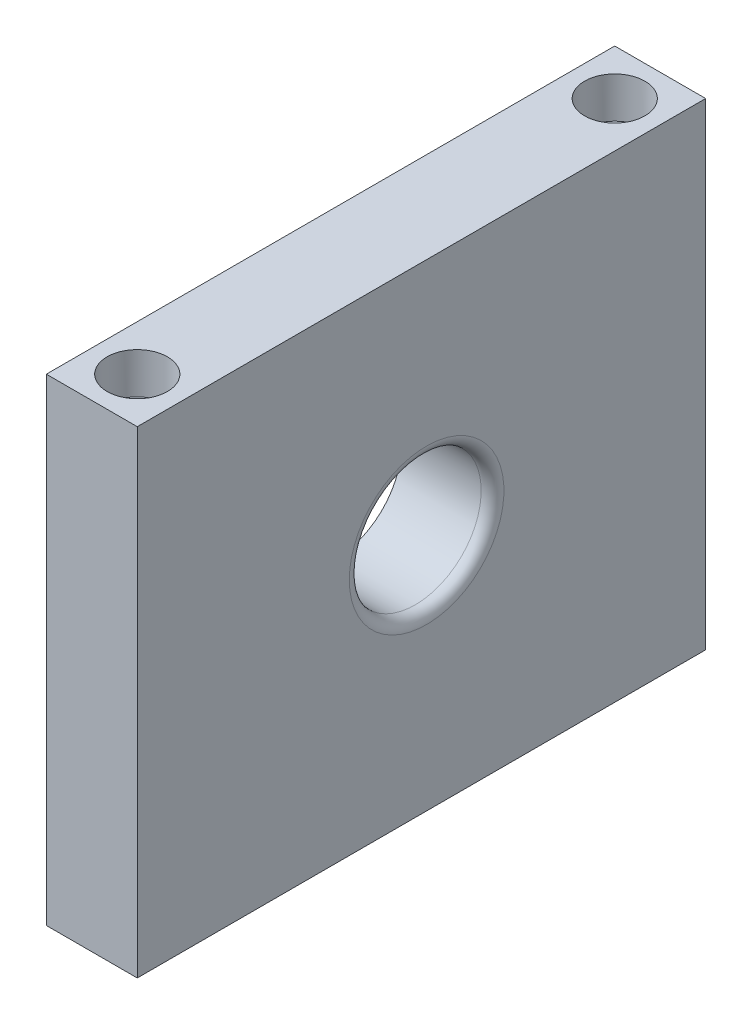
ISO-10303-21;
HEADER;
FILE_DESCRIPTION(('STEP AP214'),'2;1');
FILE_NAME('part.step','',(''),(''),'','','');
FILE_SCHEMA(('AUTOMOTIVE_DESIGN { 1 0 10303 214 1 1 1 1 }'));
ENDSEC;
DATA;
#1=APPLICATION_CONTEXT('core data for automotive mechanical design processes');
#2=APPLICATION_PROTOCOL_DEFINITION('international standard','automotive_design',2000,#1);
#3=PRODUCT_CONTEXT('',#1,'mechanical');
#4=PRODUCT('Part','Part','',(#3));
#5=PRODUCT_RELATED_PRODUCT_CATEGORY('part','',(#4));
#6=PRODUCT_DEFINITION_FORMATION('','',#4);
#7=PRODUCT_DEFINITION_CONTEXT('part definition',#1,'design');
#8=PRODUCT_DEFINITION('design','',#6,#7);
#9=PRODUCT_DEFINITION_SHAPE('','',#8);
#10=(LENGTH_UNIT() NAMED_UNIT(*) SI_UNIT(.MILLI.,.METRE.));
#11=(NAMED_UNIT(*) PLANE_ANGLE_UNIT() SI_UNIT($,.RADIAN.));
#12=(NAMED_UNIT(*) SI_UNIT($,.STERADIAN.) SOLID_ANGLE_UNIT());
#13=UNCERTAINTY_MEASURE_WITH_UNIT(LENGTH_MEASURE(1.E-05),#10,'distance_accuracy_value','');
#14=(GEOMETRIC_REPRESENTATION_CONTEXT(3) GLOBAL_UNCERTAINTY_ASSIGNED_CONTEXT((#13)) GLOBAL_UNIT_ASSIGNED_CONTEXT((#10,
#11,#12)) REPRESENTATION_CONTEXT('',''));
#15=CARTESIAN_POINT('',(0.,0.,0.));
#16=DIRECTION('',(0.,0.,1.));
#17=DIRECTION('',(1.,0.,0.));
#18=AXIS2_PLACEMENT_3D('',#15,#16,#17);
#19=CARTESIAN_POINT('',(-14.2230483271375,-3.6,-32.3847583643123));
#20=DIRECTION('',(0.,1.,0.));
#21=DIRECTION('',(0.,0.,1.));
#22=AXIS2_PLACEMENT_3D('',#19,#20,#21);
#23=PLANE('',#22);
#24=CARTESIAN_POINT('',(-14.2230483271375,-3.6,-32.3847583643123));
#25=DIRECTION('',(0.,1.,0.));
#26=DIRECTION('',(0.,0.,1.));
#27=AXIS2_PLACEMENT_3D('',#24,#25,#26);
#28=CIRCLE('',#27,1.4);
#29=CARTESIAN_POINT('',(-14.2230483271375,-3.6,-30.9847583643123));
#30=VERTEX_POINT('',#29);
#31=EDGE_CURVE('E118',#30,#30,#28,.T.);
#32=ORIENTED_EDGE('',*,*,#31,.F.);
#33=EDGE_LOOP('',(#32));
#34=FACE_BOUND('',#33,.T.);
#35=CARTESIAN_POINT('',(-14.2230483271375,-3.6,-32.3847583643123));
#36=DIRECTION('',(0.,1.,0.));
#37=DIRECTION('',(0.,0.,1.));
#38=AXIS2_PLACEMENT_3D('',#35,#36,#37);
#39=CIRCLE('',#38,2.65);
#40=CARTESIAN_POINT('',(-14.2230483271375,-3.6,-29.7347583643123));
#41=VERTEX_POINT('',#40);
#42=EDGE_CURVE('E160',#41,#41,#39,.T.);
#43=ORIENTED_EDGE('',*,*,#42,.T.);
#44=EDGE_LOOP('',(#43));
#45=FACE_BOUND('',#44,.T.);
#46=ADVANCED_FACE('F40',(#34,#45),#23,.T.);
#47=CARTESIAN_POINT('',(-14.2230483271375,-3.6,-32.3847583643123));
#48=DIRECTION('',(0.,1.,0.));
#49=DIRECTION('',(0.,0.,1.));
#50=AXIS2_PLACEMENT_3D('',#47,#48,#49);
#51=CYLINDRICAL_SURFACE('',#50,2.65);
#52=CARTESIAN_POINT('',(-14.2230483271375,0.,-32.3847583643123));
#53=DIRECTION('',(0.,-1.,0.));
#54=DIRECTION('',(0.,0.,-1.));
#55=AXIS2_PLACEMENT_3D('',#52,#53,#54);
#56=CIRCLE('',#55,2.65);
#57=CARTESIAN_POINT('',(-14.2230483271375,0.,-35.0347583643123));
#58=VERTEX_POINT('',#57);
#59=EDGE_CURVE('E132',#58,#58,#56,.F.);
#60=ORIENTED_EDGE('',*,*,#59,.T.);
#61=EDGE_LOOP('',(#60));
#62=FACE_BOUND('',#61,.T.);
#63=ORIENTED_EDGE('',*,*,#42,.F.);
#64=EDGE_LOOP('',(#63));
#65=FACE_BOUND('',#64,.T.);
#66=ADVANCED_FACE('F209',(#62,#65),#51,.F.);
#67=CARTESIAN_POINT('',(14.7769516728625,0.,-36.3847583643123));
#68=DIRECTION('',(0.,-1.,0.));
#69=DIRECTION('',(0.,0.,-1.));
#70=AXIS2_PLACEMENT_3D('',#67,#68,#69);
#71=PLANE('',#70);
#72=DIRECTION('',(0.,0.,1.));
#73=VECTOR('',#72,1.);
#74=CARTESIAN_POINT('',(-18.2230483271375,0.,0.));
#75=LINE('',#74,#73);
#76=CARTESIAN_POINT('',(-18.2230483271376,0.,-36.3847583643123));
#77=VERTEX_POINT('',#76);
#78=CARTESIAN_POINT('',(-18.2230483271375,0.,13.6152416356877));
#79=VERTEX_POINT('',#78);
#80=EDGE_CURVE('E81',#77,#79,#75,.T.);
#81=ORIENTED_EDGE('',*,*,#80,.T.);
#82=DIRECTION('',(1.,0.,0.));
#83=VECTOR('',#82,1.);
#84=CARTESIAN_POINT('',(14.7769516728625,0.,13.6152416356877));
#85=LINE('',#84,#83);
#86=CARTESIAN_POINT('',(-10.2230483271376,0.,13.6152416356877));
#87=VERTEX_POINT('',#86);
#88=EDGE_CURVE('E84',#79,#87,#85,.T.);
#89=ORIENTED_EDGE('',*,*,#88,.T.);
#90=DIRECTION('',(0.,0.,1.));
#91=VECTOR('',#90,1.);
#92=CARTESIAN_POINT('',(-10.2230483271376,0.,-36.3847583643123));
#93=LINE('',#92,#91);
#94=CARTESIAN_POINT('',(-10.2230483271376,0.,-36.3847583643123));
#95=VERTEX_POINT('',#94);
#96=EDGE_CURVE('E164',#95,#87,#93,.T.);
#97=ORIENTED_EDGE('',*,*,#96,.F.);
#98=DIRECTION('',(1.,0.,0.));
#99=VECTOR('',#98,1.);
#100=CARTESIAN_POINT('',(14.7769516728625,0.,-36.3847583643123));
#101=LINE('',#100,#99);
#102=EDGE_CURVE('E87',#77,#95,#101,.T.);
#103=ORIENTED_EDGE('',*,*,#102,.F.);
#104=EDGE_LOOP('',(#81,#89,#97,#103));
#105=FACE_BOUND('',#104,.T.);
#106=CARTESIAN_POINT('',(-14.2230483271375,0.,9.61524163568773));
#107=DIRECTION('',(0.,-1.,0.));
#108=DIRECTION('',(0.,0.,-1.));
#109=AXIS2_PLACEMENT_3D('',#106,#107,#108);
#110=CIRCLE('',#109,2.65);
#111=CARTESIAN_POINT('',(-14.2230483271375,0.,6.96524163568774));
#112=VERTEX_POINT('',#111);
#113=EDGE_CURVE('E92',#112,#112,#110,.F.);
#114=ORIENTED_EDGE('',*,*,#113,.F.);
#115=EDGE_LOOP('',(#114));
#116=FACE_BOUND('',#115,.T.);
#117=ORIENTED_EDGE('',*,*,#59,.F.);
#118=EDGE_LOOP('',(#117));
#119=FACE_BOUND('',#118,.T.);
#120=ADVANCED_FACE('F82',(#105,#116,#119),#71,.F.);
#121=CARTESIAN_POINT('',(-14.2230483271375,-3.6,9.61524163568773));
#122=DIRECTION('',(0.,1.,0.));
#123=DIRECTION('',(0.,0.,1.));
#124=AXIS2_PLACEMENT_3D('',#121,#122,#123);
#125=PLANE('',#124);
#126=CARTESIAN_POINT('',(-14.2230483271375,-3.6,9.61524163568774));
#127=DIRECTION('',(0.,-1.,0.));
#128=DIRECTION('',(0.,0.,-1.));
#129=AXIS2_PLACEMENT_3D('',#126,#127,#128);
#130=CIRCLE('',#129,1.4);
#131=CARTESIAN_POINT('',(-14.2230483271375,-3.6,8.21524163568774));
#132=VERTEX_POINT('',#131);
#133=EDGE_CURVE('E128',#132,#132,#130,.T.);
#134=ORIENTED_EDGE('',*,*,#133,.T.);
#135=EDGE_LOOP('',(#134));
#136=FACE_BOUND('',#135,.T.);
#137=CARTESIAN_POINT('',(-14.2230483271375,-3.6,9.61524163568773));
#138=DIRECTION('',(0.,1.,0.));
#139=DIRECTION('',(0.,0.,1.));
#140=AXIS2_PLACEMENT_3D('',#137,#138,#139);
#141=CIRCLE('',#140,2.65);
#142=CARTESIAN_POINT('',(-14.2230483271375,-3.6,12.2652416356877));
#143=VERTEX_POINT('',#142);
#144=EDGE_CURVE('E148',#143,#143,#141,.T.);
#145=ORIENTED_EDGE('',*,*,#144,.T.);
#146=EDGE_LOOP('',(#145));
#147=FACE_BOUND('',#146,.T.);
#148=ADVANCED_FACE('F222',(#136,#147),#125,.T.);
#149=CARTESIAN_POINT('',(-14.2230483271375,-3.6,9.61524163568773));
#150=DIRECTION('',(0.,1.,0.));
#151=DIRECTION('',(0.,0.,1.));
#152=AXIS2_PLACEMENT_3D('',#149,#150,#151);
#153=CYLINDRICAL_SURFACE('',#152,2.65);
#154=ORIENTED_EDGE('',*,*,#113,.T.);
#155=EDGE_LOOP('',(#154));
#156=FACE_BOUND('',#155,.T.);
#157=ORIENTED_EDGE('',*,*,#144,.F.);
#158=EDGE_LOOP('',(#157));
#159=FACE_BOUND('',#158,.T.);
#160=ADVANCED_FACE('F224',(#156,#159),#153,.F.);
#161=CARTESIAN_POINT('',(-10.2230483271375,3.,13.6152416356877));
#162=DIRECTION('',(0.,0.,-1.));
#163=DIRECTION('',(-1.,0.,0.));
#164=AXIS2_PLACEMENT_3D('',#161,#162,#163);
#165=PLANE('',#164);
#166=DIRECTION('',(0.,1.,0.));
#167=VECTOR('',#166,1.);
#168=CARTESIAN_POINT('',(-10.2230483271376,-42.,13.6152416356877));
#169=LINE('',#168,#167);
#170=CARTESIAN_POINT('',(-10.2230483271376,-42.,13.6152416356877));
#171=VERTEX_POINT('',#170);
#172=EDGE_CURVE('E97',#171,#87,#169,.T.);
#173=ORIENTED_EDGE('',*,*,#172,.T.);
#174=ORIENTED_EDGE('',*,*,#88,.F.);
#175=DIRECTION('',(0.,1.,0.));
#176=VECTOR('',#175,1.);
#177=CARTESIAN_POINT('',(-18.2230483271375,3.,13.6152416356877));
#178=LINE('',#177,#176);
#179=CARTESIAN_POINT('',(-18.2230483271376,-42.,13.6152416356877));
#180=VERTEX_POINT('',#179);
#181=EDGE_CURVE('E59',#180,#79,#178,.T.);
#182=ORIENTED_EDGE('',*,*,#181,.F.);
#183=DIRECTION('',(-1.,0.,0.));
#184=VECTOR('',#183,1.);
#185=CARTESIAN_POINT('',(-18.2230483271376,-42.,13.6152416356877));
#186=LINE('',#185,#184);
#187=EDGE_CURVE('E176',#171,#180,#186,.T.);
#188=ORIENTED_EDGE('',*,*,#187,.F.);
#189=EDGE_LOOP('',(#173,#174,#182,#188));
#190=FACE_BOUND('',#189,.T.);
#191=ADVANCED_FACE('F95',(#190),#165,.F.);
#192=CARTESIAN_POINT('',(-10.2230483271376,3.,-36.3847583643123));
#193=DIRECTION('',(0.,0.,1.));
#194=DIRECTION('',(1.,0.,0.));
#195=AXIS2_PLACEMENT_3D('',#192,#193,#194);
#196=PLANE('',#195);
#197=DIRECTION('',(0.,-1.,0.));
#198=VECTOR('',#197,1.);
#199=CARTESIAN_POINT('',(-18.2230483271376,3.,-36.3847583643123));
#200=LINE('',#199,#198);
#201=CARTESIAN_POINT('',(-18.2230483271376,-42.,-36.3847583643123));
#202=VERTEX_POINT('',#201);
#203=EDGE_CURVE('E107',#77,#202,#200,.T.);
#204=ORIENTED_EDGE('',*,*,#203,.F.);
#205=ORIENTED_EDGE('',*,*,#102,.T.);
#206=DIRECTION('',(0.,1.,0.));
#207=VECTOR('',#206,1.);
#208=CARTESIAN_POINT('',(-10.2230483271376,-42.,-36.3847583643123));
#209=LINE('',#208,#207);
#210=CARTESIAN_POINT('',(-10.2230483271376,-42.,-36.3847583643123));
#211=VERTEX_POINT('',#210);
#212=EDGE_CURVE('E113',#211,#95,#209,.T.);
#213=ORIENTED_EDGE('',*,*,#212,.F.);
#214=DIRECTION('',(1.,0.,0.));
#215=VECTOR('',#214,1.);
#216=CARTESIAN_POINT('',(-18.2230483271376,-42.,-36.3847583643123));
#217=LINE('',#216,#215);
#218=EDGE_CURVE('E170',#202,#211,#217,.T.);
#219=ORIENTED_EDGE('',*,*,#218,.F.);
#220=EDGE_LOOP('',(#204,#205,#213,#219));
#221=FACE_BOUND('',#220,.T.);
#222=ADVANCED_FACE('F190',(#221),#196,.F.);
#223=CARTESIAN_POINT('',(-18.2230483271375,0.,0.));
#224=DIRECTION('',(-1.,0.,0.));
#225=DIRECTION('',(0.,0.,1.));
#226=AXIS2_PLACEMENT_3D('',#223,#224,#225);
#227=PLANE('',#226);
#228=ORIENTED_EDGE('',*,*,#80,.F.);
#229=ORIENTED_EDGE('',*,*,#203,.T.);
#230=DIRECTION('',(0.,0.,-1.));
#231=VECTOR('',#230,1.);
#232=CARTESIAN_POINT('',(-18.2230483271376,-42.,-36.3847583643123));
#233=LINE('',#232,#231);
#234=EDGE_CURVE('E105',#180,#202,#233,.T.);
#235=ORIENTED_EDGE('',*,*,#234,.F.);
#236=ORIENTED_EDGE('',*,*,#181,.T.);
#237=EDGE_LOOP('',(#228,#229,#235,#236));
#238=FACE_BOUND('',#237,.T.);
#239=CARTESIAN_POINT('',(-18.2230483271375,-21.,-11.836279123996));
#240=DIRECTION('',(-1.,0.,0.));
#241=DIRECTION('',(0.,0.,1.));
#242=AXIS2_PLACEMENT_3D('',#239,#240,#241);
#243=CIRCLE('',#242,5.80237020535575);
#244=CARTESIAN_POINT('',(-18.2230483271375,-21.,-6.03390891864026));
#245=VERTEX_POINT('',#244);
#246=EDGE_CURVE('E91',#245,#245,#243,.T.);
#247=ORIENTED_EDGE('',*,*,#246,.F.);
#248=EDGE_LOOP('',(#247));
#249=FACE_BOUND('',#248,.T.);
#250=ADVANCED_FACE('F102',(#238,#249),#227,.T.);
#251=CARTESIAN_POINT('',(-10.2230483271376,-42.,-36.3847583643123));
#252=DIRECTION('',(-1.,0.,0.));
#253=DIRECTION('',(0.,0.,1.));
#254=AXIS2_PLACEMENT_3D('',#251,#252,#253);
#255=PLANE('',#254);
#256=CARTESIAN_POINT('',(-10.2230483271376,-21.,-11.836279123996));
#257=DIRECTION('',(-1.,0.,0.));
#258=DIRECTION('',(0.,0.,1.));
#259=AXIS2_PLACEMENT_3D('',#256,#257,#258);
#260=CIRCLE('',#259,6.80237020535575);
#261=CARTESIAN_POINT('',(-10.2230483271376,-21.,-5.03390891864026));
#262=VERTEX_POINT('',#261);
#263=EDGE_CURVE('E51',#262,#262,#260,.T.);
#264=ORIENTED_EDGE('',*,*,#263,.T.);
#265=EDGE_LOOP('',(#264));
#266=FACE_BOUND('',#265,.T.);
#267=ORIENTED_EDGE('',*,*,#96,.T.);
#268=ORIENTED_EDGE('',*,*,#172,.F.);
#269=DIRECTION('',(0.,0.,1.));
#270=VECTOR('',#269,1.);
#271=CARTESIAN_POINT('',(-10.2230483271376,-42.,-36.3847583643123));
#272=LINE('',#271,#270);
#273=EDGE_CURVE('E173',#211,#171,#272,.T.);
#274=ORIENTED_EDGE('',*,*,#273,.F.);
#275=ORIENTED_EDGE('',*,*,#212,.T.);
#276=EDGE_LOOP('',(#267,#268,#274,#275));
#277=FACE_BOUND('',#276,.T.);
#278=ADVANCED_FACE('F187',(#266,#277),#255,.F.);
#279=CARTESIAN_POINT('',(0.,-42.,0.));
#280=DIRECTION('',(0.,1.,0.));
#281=DIRECTION('',(0.,0.,1.));
#282=AXIS2_PLACEMENT_3D('',#279,#280,#281);
#283=PLANE('',#282);
#284=CARTESIAN_POINT('',(-14.2230483271375,-42.,-32.3847583643123));
#285=DIRECTION('',(0.,1.,0.));
#286=DIRECTION('',(0.,0.,1.));
#287=AXIS2_PLACEMENT_3D('',#284,#285,#286);
#288=CIRCLE('',#287,2.65);
#289=CARTESIAN_POINT('',(-14.2230483271375,-42.,-29.7347583643123));
#290=VERTEX_POINT('',#289);
#291=EDGE_CURVE('E149',#290,#290,#288,.T.);
#292=ORIENTED_EDGE('',*,*,#291,.T.);
#293=EDGE_LOOP('',(#292));
#294=FACE_BOUND('',#293,.T.);
#295=CARTESIAN_POINT('',(-14.2230483271375,-42.,9.61524163568773));
#296=DIRECTION('',(0.,1.,0.));
#297=DIRECTION('',(0.,0.,1.));
#298=AXIS2_PLACEMENT_3D('',#295,#296,#297);
#299=CIRCLE('',#298,2.65);
#300=CARTESIAN_POINT('',(-14.2230483271375,-42.,12.2652416356877));
#301=VERTEX_POINT('',#300);
#302=EDGE_CURVE('E143',#301,#301,#299,.T.);
#303=ORIENTED_EDGE('',*,*,#302,.T.);
#304=EDGE_LOOP('',(#303));
#305=FACE_BOUND('',#304,.T.);
#306=ORIENTED_EDGE('',*,*,#234,.T.);
#307=ORIENTED_EDGE('',*,*,#218,.T.);
#308=ORIENTED_EDGE('',*,*,#273,.T.);
#309=ORIENTED_EDGE('',*,*,#187,.T.);
#310=EDGE_LOOP('',(#306,#307,#308,#309));
#311=FACE_BOUND('',#310,.T.);
#312=ADVANCED_FACE('F192',(#294,#305,#311),#283,.F.);
#313=CARTESIAN_POINT('',(-14.2230483271375,-35.4,9.61524163568773));
#314=DIRECTION('',(0.,-1.,0.));
#315=DIRECTION('',(0.,0.,-1.));
#316=AXIS2_PLACEMENT_3D('',#313,#314,#315);
#317=CYLINDRICAL_SURFACE('',#316,2.65);
#318=CARTESIAN_POINT('',(-14.2230483271375,-35.4,9.61524163568773));
#319=DIRECTION('',(0.,1.,0.));
#320=DIRECTION('',(0.,0.,1.));
#321=AXIS2_PLACEMENT_3D('',#318,#319,#320);
#322=CIRCLE('',#321,2.65);
#323=CARTESIAN_POINT('',(-14.2230483271375,-35.4,12.2652416356877));
#324=VERTEX_POINT('',#323);
#325=EDGE_CURVE('E153',#324,#324,#322,.T.);
#326=ORIENTED_EDGE('',*,*,#325,.T.);
#327=EDGE_LOOP('',(#326));
#328=FACE_BOUND('',#327,.T.);
#329=ORIENTED_EDGE('',*,*,#302,.F.);
#330=EDGE_LOOP('',(#329));
#331=FACE_BOUND('',#330,.T.);
#332=ADVANCED_FACE('F194',(#328,#331),#317,.F.);
#333=CARTESIAN_POINT('',(-14.2230483271375,-35.4,9.61524163568773));
#334=DIRECTION('',(0.,-1.,0.));
#335=DIRECTION('',(0.,0.,1.));
#336=AXIS2_PLACEMENT_3D('',#333,#334,#335);
#337=PLANE('',#336);
#338=CARTESIAN_POINT('',(-14.2230483271375,-35.4,9.61524163568774));
#339=DIRECTION('',(0.,-1.,0.));
#340=DIRECTION('',(0.,0.,-1.));
#341=AXIS2_PLACEMENT_3D('',#338,#339,#340);
#342=CIRCLE('',#341,1.4);
#343=CARTESIAN_POINT('',(-14.2230483271375,-35.4,8.21524163568774));
#344=VERTEX_POINT('',#343);
#345=EDGE_CURVE('E44',#344,#344,#342,.F.);
#346=ORIENTED_EDGE('',*,*,#345,.T.);
#347=EDGE_LOOP('',(#346));
#348=FACE_BOUND('',#347,.T.);
#349=ORIENTED_EDGE('',*,*,#325,.F.);
#350=EDGE_LOOP('',(#349));
#351=FACE_BOUND('',#350,.T.);
#352=ADVANCED_FACE('F201',(#348,#351),#337,.T.);
#353=CARTESIAN_POINT('',(-14.2230483271375,-35.4,-32.3847583643123));
#354=DIRECTION('',(0.,-1.,0.));
#355=DIRECTION('',(0.,0.,-1.));
#356=AXIS2_PLACEMENT_3D('',#353,#354,#355);
#357=CYLINDRICAL_SURFACE('',#356,2.65);
#358=CARTESIAN_POINT('',(-14.2230483271375,-35.4,-32.3847583643123));
#359=DIRECTION('',(0.,1.,0.));
#360=DIRECTION('',(0.,0.,1.));
#361=AXIS2_PLACEMENT_3D('',#358,#359,#360);
#362=CIRCLE('',#361,2.65);
#363=CARTESIAN_POINT('',(-14.2230483271375,-35.4,-29.7347583643123));
#364=VERTEX_POINT('',#363);
#365=EDGE_CURVE('E144',#364,#364,#362,.T.);
#366=ORIENTED_EDGE('',*,*,#365,.T.);
#367=EDGE_LOOP('',(#366));
#368=FACE_BOUND('',#367,.T.);
#369=ORIENTED_EDGE('',*,*,#291,.F.);
#370=EDGE_LOOP('',(#369));
#371=FACE_BOUND('',#370,.T.);
#372=ADVANCED_FACE('F254',(#368,#371),#357,.F.);
#373=CARTESIAN_POINT('',(-14.2230483271375,-35.4,-32.3847583643123));
#374=DIRECTION('',(0.,-1.,0.));
#375=DIRECTION('',(0.,0.,1.));
#376=AXIS2_PLACEMENT_3D('',#373,#374,#375);
#377=PLANE('',#376);
#378=CARTESIAN_POINT('',(-14.2230483271375,-35.4,-32.3847583643123));
#379=DIRECTION('',(0.,-1.,0.));
#380=DIRECTION('',(0.,0.,-1.));
#381=AXIS2_PLACEMENT_3D('',#378,#379,#380);
#382=CIRCLE('',#381,1.4);
#383=CARTESIAN_POINT('',(-14.2230483271375,-35.4,-33.7847583643123));
#384=VERTEX_POINT('',#383);
#385=EDGE_CURVE('E99',#384,#384,#382,.T.);
#386=ORIENTED_EDGE('',*,*,#385,.F.);
#387=EDGE_LOOP('',(#386));
#388=FACE_BOUND('',#387,.T.);
#389=ORIENTED_EDGE('',*,*,#365,.F.);
#390=EDGE_LOOP('',(#389));
#391=FACE_BOUND('',#390,.T.);
#392=ADVANCED_FACE('F251',(#388,#391),#377,.T.);
#393=CARTESIAN_POINT('',(-9.22304832713755,-21.,-11.836279123996));
#394=DIRECTION('',(-1.,0.,0.));
#395=DIRECTION('',(0.,0.,1.));
#396=AXIS2_PLACEMENT_3D('',#393,#394,#395);
#397=CYLINDRICAL_SURFACE('',#396,5.80237020535575);
#398=CARTESIAN_POINT('',(-11.2230483271376,-21.,-11.836279123996));
#399=DIRECTION('',(-1.,0.,0.));
#400=DIRECTION('',(0.,0.,1.));
#401=AXIS2_PLACEMENT_3D('',#398,#399,#400);
#402=CIRCLE('',#401,5.80237020535575);
#403=CARTESIAN_POINT('',(-11.2230483271376,-21.,-6.03390891864026));
#404=VERTEX_POINT('',#403);
#405=EDGE_CURVE('E11',#404,#404,#402,.F.);
#406=ORIENTED_EDGE('',*,*,#405,.T.);
#407=EDGE_LOOP('',(#406));
#408=FACE_BOUND('',#407,.T.);
#409=ORIENTED_EDGE('',*,*,#246,.T.);
#410=EDGE_LOOP('',(#409));
#411=FACE_BOUND('',#410,.T.);
#412=ADVANCED_FACE('F248',(#408,#411),#397,.F.);
#413=CARTESIAN_POINT('',(-11.2230483271376,-21.,-11.836279123996));
#414=DIRECTION('',(-1.,0.,0.));
#415=DIRECTION('',(0.,0.,1.));
#416=AXIS2_PLACEMENT_3D('',#413,#414,#415);
#417=TOROIDAL_SURFACE('',#416,6.80237020535575,1.);
#418=ORIENTED_EDGE('',*,*,#405,.F.);
#419=EDGE_LOOP('',(#418));
#420=FACE_BOUND('',#419,.T.);
#421=ORIENTED_EDGE('',*,*,#263,.F.);
#422=EDGE_LOOP('',(#421));
#423=FACE_BOUND('',#422,.T.);
#424=ADVANCED_FACE('F42',(#420,#423),#417,.T.);
#425=CARTESIAN_POINT('',(-14.2230483271375,-42.,-32.3847583643123));
#426=DIRECTION('',(0.,1.,0.));
#427=DIRECTION('',(0.,0.,1.));
#428=AXIS2_PLACEMENT_3D('',#425,#426,#427);
#429=CYLINDRICAL_SURFACE('',#428,1.4);
#430=ORIENTED_EDGE('',*,*,#385,.T.);
#431=EDGE_LOOP('',(#430));
#432=FACE_BOUND('',#431,.T.);
#433=ORIENTED_EDGE('',*,*,#31,.T.);
#434=EDGE_LOOP('',(#433));
#435=FACE_BOUND('',#434,.T.);
#436=ADVANCED_FACE('F246',(#432,#435),#429,.F.);
#437=CARTESIAN_POINT('',(-14.2230483271375,-42.,9.61524163568774));
#438=DIRECTION('',(0.,1.,0.));
#439=DIRECTION('',(0.,0.,1.));
#440=AXIS2_PLACEMENT_3D('',#437,#438,#439);
#441=CYLINDRICAL_SURFACE('',#440,1.4);
#442=ORIENTED_EDGE('',*,*,#345,.F.);
#443=EDGE_LOOP('',(#442));
#444=FACE_BOUND('',#443,.T.);
#445=ORIENTED_EDGE('',*,*,#133,.F.);
#446=EDGE_LOOP('',(#445));
#447=FACE_BOUND('',#446,.T.);
#448=ADVANCED_FACE('F269',(#444,#447),#441,.F.);
#449=CLOSED_SHELL('',(#46,#66,#120,#148,#160,#191,#222,#250,#278,#312,#332,#352,#372,#392,#412,
#424,#436,#448));
#450=MANIFOLD_SOLID_BREP('B2',#449);
#451=ADVANCED_BREP_SHAPE_REPRESENTATION('',(#18,#450),#14);
#452=SHAPE_DEFINITION_REPRESENTATION(#9,#451);
ENDSEC;
END-ISO-10303-21;
